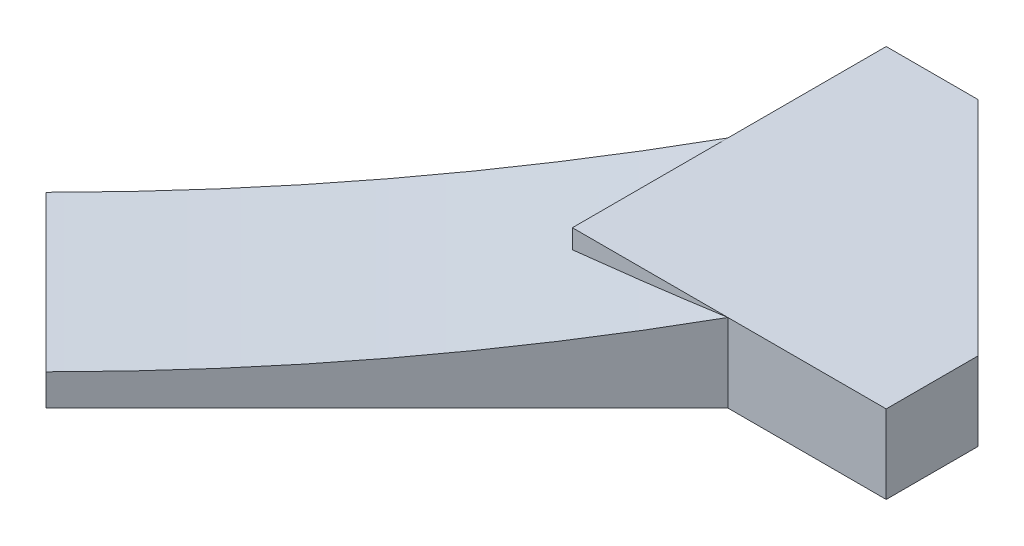
ISO-10303-21;
HEADER;
FILE_DESCRIPTION(('STEP AP214'),'2;1');
FILE_NAME('part.step','',(''),(''),'','','');
FILE_SCHEMA(('AUTOMOTIVE_DESIGN { 1 0 10303 214 1 1 1 1 }'));
ENDSEC;
DATA;
#1=APPLICATION_CONTEXT('core data for automotive mechanical design processes');
#2=APPLICATION_PROTOCOL_DEFINITION('international standard','automotive_design',2000,#1);
#3=PRODUCT_CONTEXT('',#1,'mechanical');
#4=PRODUCT('Part','Part','',(#3));
#5=PRODUCT_RELATED_PRODUCT_CATEGORY('part','',(#4));
#6=PRODUCT_DEFINITION_FORMATION('','',#4);
#7=PRODUCT_DEFINITION_CONTEXT('part definition',#1,'design');
#8=PRODUCT_DEFINITION('design','',#6,#7);
#9=PRODUCT_DEFINITION_SHAPE('','',#8);
#10=(LENGTH_UNIT() NAMED_UNIT(*) SI_UNIT(.MILLI.,.METRE.));
#11=(NAMED_UNIT(*) PLANE_ANGLE_UNIT() SI_UNIT($,.RADIAN.));
#12=(NAMED_UNIT(*) SI_UNIT($,.STERADIAN.) SOLID_ANGLE_UNIT());
#13=UNCERTAINTY_MEASURE_WITH_UNIT(LENGTH_MEASURE(1.E-05),#10,'distance_accuracy_value','');
#14=(GEOMETRIC_REPRESENTATION_CONTEXT(3) GLOBAL_UNCERTAINTY_ASSIGNED_CONTEXT((#13)) GLOBAL_UNIT_ASSIGNED_CONTEXT((#10,
#11,#12)) REPRESENTATION_CONTEXT('',''));
#15=CARTESIAN_POINT('',(0.,0.,0.));
#16=DIRECTION('',(0.,0.,1.));
#17=DIRECTION('',(1.,0.,0.));
#18=AXIS2_PLACEMENT_3D('',#15,#16,#17);
#19=CARTESIAN_POINT('',(0.,5.,-20.));
#20=DIRECTION('',(1.,0.,0.));
#21=DIRECTION('',(0.,0.,-1.));
#22=AXIS2_PLACEMENT_3D('',#19,#20,#21);
#23=PLANE('',#22);
#24=DIRECTION('',(0.,0.,1.));
#25=VECTOR('',#24,1.);
#26=CARTESIAN_POINT('',(0.,0.,-20.));
#27=LINE('',#26,#25);
#28=CARTESIAN_POINT('',(0.,0.,-20.));
#29=VERTEX_POINT('',#28);
#30=CARTESIAN_POINT('',(0.,0.,-9.90735931288072));
#31=VERTEX_POINT('',#30);
#32=EDGE_CURVE('E135',#29,#31,#27,.T.);
#33=ORIENTED_EDGE('',*,*,#32,.T.);
#34=DIRECTION('',(0.,-1.,0.));
#35=VECTOR('',#34,1.);
#36=CARTESIAN_POINT('',(0.,5.,-9.90735931288072));
#37=LINE('',#36,#35);
#38=CARTESIAN_POINT('',(0.,5.,-9.90735931288072));
#39=VERTEX_POINT('',#38);
#40=EDGE_CURVE('E178',#39,#31,#37,.T.);
#41=ORIENTED_EDGE('',*,*,#40,.F.);
#42=DIRECTION('',(0.,0.,1.));
#43=VECTOR('',#42,1.);
#44=CARTESIAN_POINT('',(0.,5.,-20.));
#45=LINE('',#44,#43);
#46=CARTESIAN_POINT('',(0.,5.,-20.));
#47=VERTEX_POINT('',#46);
#48=EDGE_CURVE('E161',#47,#39,#45,.T.);
#49=ORIENTED_EDGE('',*,*,#48,.F.);
#50=DIRECTION('',(0.,-1.,0.));
#51=VECTOR('',#50,1.);
#52=CARTESIAN_POINT('',(0.,5.,-20.));
#53=LINE('',#52,#51);
#54=EDGE_CURVE('E131',#47,#29,#53,.T.);
#55=ORIENTED_EDGE('',*,*,#54,.T.);
#56=EDGE_LOOP('',(#33,#41,#49,#55));
#57=FACE_BOUND('',#56,.T.);
#58=ADVANCED_FACE('F39',(#57),#23,.F.);
#59=CARTESIAN_POINT('',(-21.7271644662754,5.,11.8198051533946));
#60=DIRECTION('',(0.707106781186548,0.,0.707106781186547));
#61=DIRECTION('',(0.707106781186547,0.,-0.707106781186548));
#62=AXIS2_PLACEMENT_3D('',#59,#60,#61);
#63=PLANE('',#62);
#64=DIRECTION('',(0.,-1.,0.));
#65=VECTOR('',#64,1.);
#66=CARTESIAN_POINT('',(-21.7271644662754,5.,11.8198051533946));
#67=LINE('',#66,#65);
#68=CARTESIAN_POINT('',(-21.7271644662753,2.,11.8198051533946));
#69=VERTEX_POINT('',#68);
#70=CARTESIAN_POINT('',(-21.7271644662754,0.,11.8198051533946));
#71=VERTEX_POINT('',#70);
#72=EDGE_CURVE('E175',#69,#71,#67,.T.);
#73=ORIENTED_EDGE('',*,*,#72,.F.);
#74=CARTESIAN_POINT('',(-21.7271644662753,160.856558581529,11.8198051533946));
#75=DIRECTION('',(0.707106781186548,0.,0.707106781186547));
#76=DIRECTION('',(0.707106781186547,0.,-0.707106781186548));
#77=AXIS2_PLACEMENT_3D('',#74,#75,#76);
#78=CIRCLE('',#77,158.856558581529);
#79=EDGE_CURVE('E140',#69,#39,#78,.T.);
#80=ORIENTED_EDGE('',*,*,#79,.T.);
#81=ORIENTED_EDGE('',*,*,#40,.T.);
#82=DIRECTION('',(-0.707106781186547,0.,0.707106781186548));
#83=VECTOR('',#82,1.);
#84=CARTESIAN_POINT('',(-21.7271644662754,0.,11.8198051533946));
#85=LINE('',#84,#83);
#86=EDGE_CURVE('E139',#31,#71,#85,.T.);
#87=ORIENTED_EDGE('',*,*,#86,.T.);
#88=EDGE_LOOP('',(#73,#80,#81,#87));
#89=FACE_BOUND('',#88,.T.);
#90=ADVANCED_FACE('F201',(#89),#63,.F.);
#91=CARTESIAN_POINT('',(-21.7271644662754,5.,11.8198051533946));
#92=DIRECTION('',(0.707106781186548,0.,-0.707106781186548));
#93=DIRECTION('',(-0.707106781186548,0.,-0.707106781186548));
#94=AXIS2_PLACEMENT_3D('',#91,#92,#93);
#95=PLANE('',#94);
#96=DIRECTION('',(0.,-1.,0.));
#97=VECTOR('',#96,1.);
#98=CARTESIAN_POINT('',(-11.8198051533946,5.,21.7271644662753));
#99=LINE('',#98,#97);
#100=CARTESIAN_POINT('',(-11.8198051533946,2.,21.7271644662753));
#101=VERTEX_POINT('',#100);
#102=CARTESIAN_POINT('',(-11.8198051533946,0.,21.7271644662753));
#103=VERTEX_POINT('',#102);
#104=EDGE_CURVE('E172',#101,#103,#99,.T.);
#105=ORIENTED_EDGE('',*,*,#104,.F.);
#106=DIRECTION('',(0.707106781186547,0.,0.707106781186548));
#107=VECTOR('',#106,1.);
#108=CARTESIAN_POINT('',(-25.9619407771256,2.,7.58502884254439));
#109=LINE('',#108,#107);
#110=EDGE_CURVE('E204',#69,#101,#109,.T.);
#111=ORIENTED_EDGE('',*,*,#110,.F.);
#112=ORIENTED_EDGE('',*,*,#72,.T.);
#113=DIRECTION('',(0.707106781186548,0.,0.707106781186548));
#114=VECTOR('',#113,1.);
#115=CARTESIAN_POINT('',(-21.7271644662754,0.,11.8198051533946));
#116=LINE('',#115,#114);
#117=EDGE_CURVE('E144',#71,#103,#116,.T.);
#118=ORIENTED_EDGE('',*,*,#117,.T.);
#119=EDGE_LOOP('',(#105,#111,#112,#118));
#120=FACE_BOUND('',#119,.T.);
#121=ADVANCED_FACE('F218',(#120),#95,.F.);
#122=CARTESIAN_POINT('',(9.90735931288071,5.,0.));
#123=DIRECTION('',(-0.707106781186547,0.,-0.707106781186548));
#124=DIRECTION('',(-0.707106781186548,0.,0.707106781186547));
#125=AXIS2_PLACEMENT_3D('',#122,#123,#124);
#126=PLANE('',#125);
#127=DIRECTION('',(0.,-1.,0.));
#128=VECTOR('',#127,1.);
#129=CARTESIAN_POINT('',(9.90735931288071,5.,0.));
#130=LINE('',#129,#128);
#131=CARTESIAN_POINT('',(9.90735931288071,5.,0.));
#132=VERTEX_POINT('',#131);
#133=CARTESIAN_POINT('',(9.90735931288071,0.,0.));
#134=VERTEX_POINT('',#133);
#135=EDGE_CURVE('E168',#132,#134,#130,.T.);
#136=ORIENTED_EDGE('',*,*,#135,.F.);
#137=CARTESIAN_POINT('',(-11.8198051533946,160.856558581529,21.7271644662753));
#138=DIRECTION('',(0.707106781186547,0.,0.707106781186548));
#139=DIRECTION('',(0.707106781186548,0.,-0.707106781186547));
#140=AXIS2_PLACEMENT_3D('',#137,#138,#139);
#141=CIRCLE('',#140,158.856558581529);
#142=EDGE_CURVE('E222',#101,#132,#141,.T.);
#143=ORIENTED_EDGE('',*,*,#142,.F.);
#144=ORIENTED_EDGE('',*,*,#104,.T.);
#145=DIRECTION('',(0.707106781186548,0.,-0.707106781186547));
#146=VECTOR('',#145,1.);
#147=CARTESIAN_POINT('',(9.90735931288071,0.,0.));
#148=LINE('',#147,#146);
#149=EDGE_CURVE('E148',#103,#134,#148,.T.);
#150=ORIENTED_EDGE('',*,*,#149,.T.);
#151=EDGE_LOOP('',(#136,#143,#144,#150));
#152=FACE_BOUND('',#151,.T.);
#153=ADVANCED_FACE('F241',(#152),#126,.F.);
#154=CARTESIAN_POINT('',(20.,5.,0.));
#155=DIRECTION('',(0.,0.,-1.));
#156=DIRECTION('',(-1.,0.,0.));
#157=AXIS2_PLACEMENT_3D('',#154,#155,#156);
#158=PLANE('',#157);
#159=DIRECTION('',(1.,0.,0.));
#160=VECTOR('',#159,1.);
#161=CARTESIAN_POINT('',(20.,0.,0.));
#162=LINE('',#161,#160);
#163=CARTESIAN_POINT('',(20.,0.,0.));
#164=VERTEX_POINT('',#163);
#165=EDGE_CURVE('E152',#134,#164,#162,.T.);
#166=ORIENTED_EDGE('',*,*,#165,.T.);
#167=DIRECTION('',(0.,-1.,0.));
#168=VECTOR('',#167,1.);
#169=CARTESIAN_POINT('',(20.,5.,0.));
#170=LINE('',#169,#168);
#171=CARTESIAN_POINT('',(20.,5.,0.));
#172=VERTEX_POINT('',#171);
#173=EDGE_CURVE('E124',#172,#164,#170,.T.);
#174=ORIENTED_EDGE('',*,*,#173,.F.);
#175=DIRECTION('',(1.,0.,0.));
#176=VECTOR('',#175,1.);
#177=CARTESIAN_POINT('',(14.15,5.,0.));
#178=LINE('',#177,#176);
#179=EDGE_CURVE('E113',#132,#172,#178,.T.);
#180=ORIENTED_EDGE('',*,*,#179,.F.);
#181=ORIENTED_EDGE('',*,*,#135,.T.);
#182=EDGE_LOOP('',(#166,#174,#180,#181));
#183=FACE_BOUND('',#182,.T.);
#184=ADVANCED_FACE('F243',(#183),#158,.F.);
#185=CARTESIAN_POINT('',(20.,5.,0.));
#186=DIRECTION('',(-1.,0.,0.));
#187=DIRECTION('',(0.,0.,1.));
#188=AXIS2_PLACEMENT_3D('',#185,#186,#187);
#189=PLANE('',#188);
#190=DIRECTION('',(0.,0.,-1.));
#191=VECTOR('',#190,1.);
#192=CARTESIAN_POINT('',(20.,0.,0.));
#193=LINE('',#192,#191);
#194=CARTESIAN_POINT('',(20.,0.,-5.85));
#195=VERTEX_POINT('',#194);
#196=EDGE_CURVE('E122',#164,#195,#193,.T.);
#197=ORIENTED_EDGE('',*,*,#196,.T.);
#198=DIRECTION('',(0.,-1.,0.));
#199=VECTOR('',#198,1.);
#200=CARTESIAN_POINT('',(20.,5.,-5.85));
#201=LINE('',#200,#199);
#202=CARTESIAN_POINT('',(20.,5.,-5.85));
#203=VERTEX_POINT('',#202);
#204=EDGE_CURVE('E119',#203,#195,#201,.T.);
#205=ORIENTED_EDGE('',*,*,#204,.F.);
#206=DIRECTION('',(0.,0.,-1.));
#207=VECTOR('',#206,1.);
#208=CARTESIAN_POINT('',(20.,5.,0.));
#209=LINE('',#208,#207);
#210=EDGE_CURVE('E107',#172,#203,#209,.T.);
#211=ORIENTED_EDGE('',*,*,#210,.F.);
#212=ORIENTED_EDGE('',*,*,#173,.T.);
#213=EDGE_LOOP('',(#197,#205,#211,#212));
#214=FACE_BOUND('',#213,.T.);
#215=ADVANCED_FACE('F120',(#214),#189,.F.);
#216=CARTESIAN_POINT('',(5.85,5.,-20.));
#217=DIRECTION('',(-0.707106781186548,0.,0.707106781186548));
#218=DIRECTION('',(0.707106781186548,0.,0.707106781186548));
#219=AXIS2_PLACEMENT_3D('',#216,#217,#218);
#220=PLANE('',#219);
#221=DIRECTION('',(-0.707106781186548,0.,-0.707106781186548));
#222=VECTOR('',#221,1.);
#223=CARTESIAN_POINT('',(5.85,0.,-20.));
#224=LINE('',#223,#222);
#225=CARTESIAN_POINT('',(5.85,0.,-20.));
#226=VERTEX_POINT('',#225);
#227=EDGE_CURVE('E86',#195,#226,#224,.T.);
#228=ORIENTED_EDGE('',*,*,#227,.T.);
#229=DIRECTION('',(0.,-1.,0.));
#230=VECTOR('',#229,1.);
#231=CARTESIAN_POINT('',(5.85,5.,-20.));
#232=LINE('',#231,#230);
#233=CARTESIAN_POINT('',(5.85,5.,-20.));
#234=VERTEX_POINT('',#233);
#235=EDGE_CURVE('E125',#234,#226,#232,.T.);
#236=ORIENTED_EDGE('',*,*,#235,.F.);
#237=DIRECTION('',(-0.707106781186548,0.,-0.707106781186548));
#238=VECTOR('',#237,1.);
#239=CARTESIAN_POINT('',(5.85,5.,-20.));
#240=LINE('',#239,#238);
#241=EDGE_CURVE('E111',#203,#234,#240,.T.);
#242=ORIENTED_EDGE('',*,*,#241,.F.);
#243=ORIENTED_EDGE('',*,*,#204,.T.);
#244=EDGE_LOOP('',(#228,#236,#242,#243));
#245=FACE_BOUND('',#244,.T.);
#246=ADVANCED_FACE('F127',(#245),#220,.F.);
#247=CARTESIAN_POINT('',(0.,5.,-20.));
#248=DIRECTION('',(0.,0.,1.));
#249=DIRECTION('',(1.,0.,0.));
#250=AXIS2_PLACEMENT_3D('',#247,#248,#249);
#251=PLANE('',#250);
#252=DIRECTION('',(-1.,0.,0.));
#253=VECTOR('',#252,1.);
#254=CARTESIAN_POINT('',(0.,0.,-20.));
#255=LINE('',#254,#253);
#256=EDGE_CURVE('E92',#226,#29,#255,.T.);
#257=ORIENTED_EDGE('',*,*,#256,.T.);
#258=ORIENTED_EDGE('',*,*,#54,.F.);
#259=DIRECTION('',(-1.,0.,0.));
#260=VECTOR('',#259,1.);
#261=CARTESIAN_POINT('',(0.,5.,-20.));
#262=LINE('',#261,#260);
#263=EDGE_CURVE('E56',#234,#47,#262,.T.);
#264=ORIENTED_EDGE('',*,*,#263,.F.);
#265=ORIENTED_EDGE('',*,*,#235,.T.);
#266=EDGE_LOOP('',(#257,#258,#264,#265));
#267=FACE_BOUND('',#266,.T.);
#268=ADVANCED_FACE('F284',(#267),#251,.F.);
#269=CARTESIAN_POINT('',(0.,5.,0.));
#270=DIRECTION('',(0.,-1.,0.));
#271=DIRECTION('',(0.,0.,-1.));
#272=AXIS2_PLACEMENT_3D('',#269,#270,#271);
#273=PLANE('',#272);
#274=ORIENTED_EDGE('',*,*,#48,.T.);
#275=DIRECTION('',(0.,0.,1.));
#276=VECTOR('',#275,1.);
#277=CARTESIAN_POINT('',(0.,5.,-9.90735931288072));
#278=LINE('',#277,#276);
#279=CARTESIAN_POINT('',(0.,5.,0.));
#280=VERTEX_POINT('',#279);
#281=EDGE_CURVE('E207',#39,#280,#278,.T.);
#282=ORIENTED_EDGE('',*,*,#281,.T.);
#283=DIRECTION('',(1.,0.,0.));
#284=VECTOR('',#283,1.);
#285=CARTESIAN_POINT('',(0.,5.,0.));
#286=LINE('',#285,#284);
#287=EDGE_CURVE('E100',#280,#132,#286,.T.);
#288=ORIENTED_EDGE('',*,*,#287,.T.);
#289=ORIENTED_EDGE('',*,*,#179,.T.);
#290=ORIENTED_EDGE('',*,*,#210,.T.);
#291=ORIENTED_EDGE('',*,*,#241,.T.);
#292=ORIENTED_EDGE('',*,*,#263,.T.);
#293=EDGE_LOOP('',(#274,#282,#288,#289,#290,#291,#292));
#294=FACE_BOUND('',#293,.T.);
#295=ADVANCED_FACE('F109',(#294),#273,.F.);
#296=CARTESIAN_POINT('',(0.,0.,0.));
#297=DIRECTION('',(0.,-1.,0.));
#298=DIRECTION('',(0.,0.,-1.));
#299=AXIS2_PLACEMENT_3D('',#296,#297,#298);
#300=PLANE('',#299);
#301=ORIENTED_EDGE('',*,*,#86,.F.);
#302=ORIENTED_EDGE('',*,*,#32,.F.);
#303=ORIENTED_EDGE('',*,*,#256,.F.);
#304=ORIENTED_EDGE('',*,*,#227,.F.);
#305=ORIENTED_EDGE('',*,*,#196,.F.);
#306=ORIENTED_EDGE('',*,*,#165,.F.);
#307=ORIENTED_EDGE('',*,*,#149,.F.);
#308=ORIENTED_EDGE('',*,*,#117,.F.);
#309=EDGE_LOOP('',(#301,#302,#303,#304,#305,#306,#307,#308));
#310=FACE_BOUND('',#309,.T.);
#311=ADVANCED_FACE('F213',(#310),#300,.T.);
#312=CARTESIAN_POINT('',(-25.9619407771256,160.856558581529,7.58502884254439));
#313=DIRECTION('',(0.707106781186547,0.,0.707106781186548));
#314=DIRECTION('',(0.707106781186548,0.,-0.707106781186547));
#315=AXIS2_PLACEMENT_3D('',#312,#313,#314);
#316=CYLINDRICAL_SURFACE('',#315,158.856558581529);
#317=ORIENTED_EDGE('',*,*,#142,.T.);
#318=CARTESIAN_POINT('',(-33.54696961967,160.856558581529,0.));
#319=DIRECTION('',(0.,0.,1.));
#320=DIRECTION('',(1.,0.,0.));
#321=AXIS2_PLACEMENT_3D('',#318,#319,#320);
#322=ELLIPSE('',#321,224.657099617914,158.856558581529);
#323=CARTESIAN_POINT('',(0.,3.78107793914734,0.));
#324=VERTEX_POINT('',#323);
#325=EDGE_CURVE('E11',#132,#324,#322,.F.);
#326=ORIENTED_EDGE('',*,*,#325,.T.);
#327=CARTESIAN_POINT('',(0.,160.856558581529,33.54696961967));
#328=DIRECTION('',(-1.,0.,0.));
#329=DIRECTION('',(0.,0.,1.));
#330=AXIS2_PLACEMENT_3D('',#327,#328,#329);
#331=ELLIPSE('',#330,224.657099617914,158.856558581529);
#332=EDGE_CURVE('E48',#324,#39,#331,.F.);
#333=ORIENTED_EDGE('',*,*,#332,.T.);
#334=ORIENTED_EDGE('',*,*,#79,.F.);
#335=ORIENTED_EDGE('',*,*,#110,.T.);
#336=EDGE_LOOP('',(#317,#326,#333,#334,#335));
#337=FACE_BOUND('',#336,.T.);
#338=ADVANCED_FACE('F189',(#337),#316,.F.);
#339=CARTESIAN_POINT('',(0.,0.,0.));
#340=DIRECTION('',(0.,0.,1.));
#341=DIRECTION('',(1.,0.,0.));
#342=AXIS2_PLACEMENT_3D('',#339,#340,#341);
#343=PLANE('',#342);
#344=ORIENTED_EDGE('',*,*,#325,.F.);
#345=ORIENTED_EDGE('',*,*,#287,.F.);
#346=DIRECTION('',(0.,1.,0.));
#347=VECTOR('',#346,1.);
#348=CARTESIAN_POINT('',(0.,0.,0.));
#349=LINE('',#348,#347);
#350=EDGE_CURVE('E225',#324,#280,#349,.T.);
#351=ORIENTED_EDGE('',*,*,#350,.F.);
#352=EDGE_LOOP('',(#344,#345,#351));
#353=FACE_BOUND('',#352,.T.);
#354=ADVANCED_FACE('F237',(#353),#343,.T.);
#355=CARTESIAN_POINT('',(0.,0.,-9.90735931288072));
#356=DIRECTION('',(-1.,0.,0.));
#357=DIRECTION('',(0.,0.,1.));
#358=AXIS2_PLACEMENT_3D('',#355,#356,#357);
#359=PLANE('',#358);
#360=ORIENTED_EDGE('',*,*,#332,.F.);
#361=ORIENTED_EDGE('',*,*,#350,.T.);
#362=ORIENTED_EDGE('',*,*,#281,.F.);
#363=EDGE_LOOP('',(#360,#361,#362));
#364=FACE_BOUND('',#363,.T.);
#365=ADVANCED_FACE('F234',(#364),#359,.T.);
#366=CLOSED_SHELL('',(#58,#90,#121,#153,#184,#215,#246,#268,#295,#311,#338,#354,#365));
#367=MANIFOLD_SOLID_BREP('B2',#366);
#368=ADVANCED_BREP_SHAPE_REPRESENTATION('',(#18,#367),#14);
#369=SHAPE_DEFINITION_REPRESENTATION(#9,#368);
ENDSEC;
END-ISO-10303-21;
